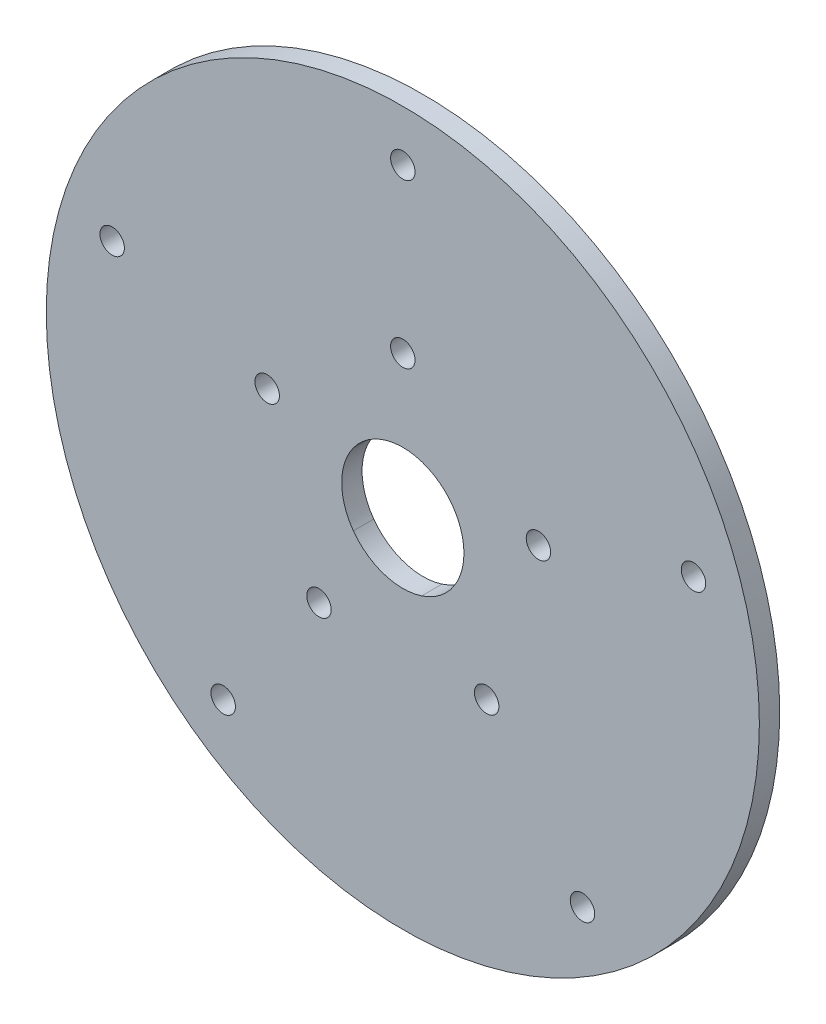
ISO-10303-21;
HEADER;
FILE_DESCRIPTION(('STEP AP214'),'2;1');
FILE_NAME('part.step','',(''),(''),'','','');
FILE_SCHEMA(('AUTOMOTIVE_DESIGN { 1 0 10303 214 1 1 1 1 }'));
ENDSEC;
DATA;
#1=APPLICATION_CONTEXT('core data for automotive mechanical design processes');
#2=APPLICATION_PROTOCOL_DEFINITION('international standard','automotive_design',2000,#1);
#3=PRODUCT_CONTEXT('',#1,'mechanical');
#4=PRODUCT('Part','Part','',(#3));
#5=PRODUCT_RELATED_PRODUCT_CATEGORY('part','',(#4));
#6=PRODUCT_DEFINITION_FORMATION('','',#4);
#7=PRODUCT_DEFINITION_CONTEXT('part definition',#1,'design');
#8=PRODUCT_DEFINITION('design','',#6,#7);
#9=PRODUCT_DEFINITION_SHAPE('','',#8);
#10=(LENGTH_UNIT() NAMED_UNIT(*) SI_UNIT(.MILLI.,.METRE.));
#11=(NAMED_UNIT(*) PLANE_ANGLE_UNIT() SI_UNIT($,.RADIAN.));
#12=(NAMED_UNIT(*) SI_UNIT($,.STERADIAN.) SOLID_ANGLE_UNIT());
#13=UNCERTAINTY_MEASURE_WITH_UNIT(LENGTH_MEASURE(1.E-05),#10,'distance_accuracy_value','');
#14=(GEOMETRIC_REPRESENTATION_CONTEXT(3) GLOBAL_UNCERTAINTY_ASSIGNED_CONTEXT((#13)) GLOBAL_UNIT_ASSIGNED_CONTEXT((#10,
#11,#12)) REPRESENTATION_CONTEXT('',''));
#15=CARTESIAN_POINT('',(0.,0.,0.));
#16=DIRECTION('',(0.,0.,1.));
#17=DIRECTION('',(1.,0.,0.));
#18=AXIS2_PLACEMENT_3D('',#15,#16,#17);
#19=CARTESIAN_POINT('',(0.00111803398874989,0.000363271264002675,10.));
#20=DIRECTION('',(0.,0.,-1.));
#21=DIRECTION('',(-1.,0.,0.));
#22=AXIS2_PLACEMENT_3D('',#19,#20,#21);
#23=CYLINDRICAL_SURFACE('',#22,30.);
#24=CARTESIAN_POINT('',(0.00111803398874989,0.000363271264002675,0.));
#25=DIRECTION('',(0.,0.,1.));
#26=DIRECTION('',(1.,0.,0.));
#27=AXIS2_PLACEMENT_3D('',#24,#25,#26);
#28=CIRCLE('',#27,30.);
#29=CARTESIAN_POINT('',(9.27106884637913,-28.5315138477736,0.));
#30=VERTEX_POINT('',#29);
#31=CARTESIAN_POINT('',(30.0011180282306,0.000951056604623031,0.));
#32=VERTEX_POINT('',#31);
#33=EDGE_CURVE('E113',#30,#32,#28,.T.);
#34=ORIENTED_EDGE('',*,*,#33,.F.);
#35=DIRECTION('',(0.,0.,-1.));
#36=VECTOR('',#35,1.);
#37=CARTESIAN_POINT('',(9.27106884637913,-28.5315138477736,10.));
#38=LINE('',#37,#36);
#39=CARTESIAN_POINT('',(9.27106884637913,-28.5315138477736,10.));
#40=VERTEX_POINT('',#39);
#41=EDGE_CURVE('E11',#40,#30,#38,.T.);
#42=ORIENTED_EDGE('',*,*,#41,.F.);
#43=CARTESIAN_POINT('',(0.00111803398874989,0.000363271264002675,10.));
#44=DIRECTION('',(0.,0.,1.));
#45=DIRECTION('',(1.,0.,0.));
#46=AXIS2_PLACEMENT_3D('',#43,#44,#45);
#47=CIRCLE('',#46,30.);
#48=CARTESIAN_POINT('',(30.0011180282306,0.000951056604623031,10.));
#49=VERTEX_POINT('',#48);
#50=EDGE_CURVE('E128',#40,#49,#47,.T.);
#51=ORIENTED_EDGE('',*,*,#50,.T.);
#52=DIRECTION('',(0.,0.,-1.));
#53=VECTOR('',#52,1.);
#54=CARTESIAN_POINT('',(30.0011180282306,0.000951056604623031,10.));
#55=LINE('',#54,#53);
#56=EDGE_CURVE('E52',#49,#32,#55,.T.);
#57=ORIENTED_EDGE('',*,*,#56,.T.);
#58=EDGE_LOOP('',(#34,#42,#51,#57));
#59=FACE_BOUND('',#58,.T.);
#60=ADVANCED_FACE('F36',(#59),#23,.F.);
#61=CARTESIAN_POINT('',(0.,0.,10.));
#62=DIRECTION('',(0.,0.,-1.));
#63=DIRECTION('',(-1.,0.,0.));
#64=AXIS2_PLACEMENT_3D('',#61,#62,#63);
#65=CYLINDRICAL_SURFACE('',#64,30.);
#66=CARTESIAN_POINT('',(0.,0.,0.));
#67=DIRECTION('',(0.,0.,1.));
#68=DIRECTION('',(1.,0.,0.));
#69=AXIS2_PLACEMENT_3D('',#66,#67,#68);
#70=CIRCLE('',#69,30.);
#71=CARTESIAN_POINT('',(-24.2708553180407,-17.6330820372031,0.));
#72=VERTEX_POINT('',#71);
#73=EDGE_CURVE('E115',#72,#30,#70,.T.);
#74=ORIENTED_EDGE('',*,*,#73,.F.);
#75=DIRECTION('',(0.,0.,-1.));
#76=VECTOR('',#75,1.);
#77=CARTESIAN_POINT('',(-24.2708553180407,-17.6330820372031,10.));
#78=LINE('',#77,#76);
#79=CARTESIAN_POINT('',(-24.2708553180407,-17.6330820372031,10.));
#80=VERTEX_POINT('',#79);
#81=EDGE_CURVE('E44',#80,#72,#78,.T.);
#82=ORIENTED_EDGE('',*,*,#81,.F.);
#83=CARTESIAN_POINT('',(0.,0.,10.));
#84=DIRECTION('',(0.,0.,1.));
#85=DIRECTION('',(1.,0.,0.));
#86=AXIS2_PLACEMENT_3D('',#83,#84,#85);
#87=CIRCLE('',#86,30.);
#88=EDGE_CURVE('E102',#80,#40,#87,.T.);
#89=ORIENTED_EDGE('',*,*,#88,.T.);
#90=ORIENTED_EDGE('',*,*,#41,.T.);
#91=EDGE_LOOP('',(#74,#82,#89,#90));
#92=FACE_BOUND('',#91,.T.);
#93=ADVANCED_FACE('F132',(#92),#65,.F.);
#94=CARTESIAN_POINT('',(-0.000690983005625056,0.000951056516295156,10.));
#95=DIRECTION('',(0.,0.,-1.));
#96=DIRECTION('',(-1.,0.,0.));
#97=AXIS2_PLACEMENT_3D('',#94,#95,#96);
#98=CYLINDRICAL_SURFACE('',#97,30.);
#99=CARTESIAN_POINT('',(-0.000690983005625056,0.000951056516295156,0.));
#100=DIRECTION('',(0.,0.,1.));
#101=DIRECTION('',(1.,0.,0.));
#102=AXIS2_PLACEMENT_3D('',#99,#100,#101);
#103=CIRCLE('',#102,30.);
#104=CARTESIAN_POINT('',(-24.2708553180927,17.6349841501641,0.));
#105=VERTEX_POINT('',#104);
#106=EDGE_CURVE('E89',#105,#72,#103,.T.);
#107=ORIENTED_EDGE('',*,*,#106,.F.);
#108=DIRECTION('',(0.,0.,-1.));
#109=VECTOR('',#108,1.);
#110=CARTESIAN_POINT('',(-24.2708553180927,17.6349841501641,10.));
#111=LINE('',#110,#109);
#112=CARTESIAN_POINT('',(-24.2708553180927,17.6349841501641,10.));
#113=VERTEX_POINT('',#112);
#114=EDGE_CURVE('E84',#113,#105,#111,.T.);
#115=ORIENTED_EDGE('',*,*,#114,.F.);
#116=CARTESIAN_POINT('',(-0.000690983005625056,0.000951056516295156,10.));
#117=DIRECTION('',(0.,0.,1.));
#118=DIRECTION('',(1.,0.,0.));
#119=AXIS2_PLACEMENT_3D('',#116,#117,#118);
#120=CIRCLE('',#119,30.);
#121=EDGE_CURVE('E87',#113,#80,#120,.T.);
#122=ORIENTED_EDGE('',*,*,#121,.T.);
#123=ORIENTED_EDGE('',*,*,#81,.T.);
#124=EDGE_LOOP('',(#107,#115,#122,#123));
#125=FACE_BOUND('',#124,.T.);
#126=ADVANCED_FACE('F86',(#125),#98,.F.);
#127=CARTESIAN_POINT('',(0.,0.00190211303259031,10.));
#128=DIRECTION('',(0.,0.,-1.));
#129=DIRECTION('',(-1.,0.,0.));
#130=AXIS2_PLACEMENT_3D('',#127,#128,#129);
#131=CYLINDRICAL_SURFACE('',#130,30.);
#132=CARTESIAN_POINT('',(0.,0.00190211303259031,0.));
#133=DIRECTION('',(0.,0.,1.));
#134=DIRECTION('',(1.,0.,0.));
#135=AXIS2_PLACEMENT_3D('',#132,#133,#134);
#136=CIRCLE('',#135,30.);
#137=CARTESIAN_POINT('',(9.27106884654775,28.5334159607514,0.));
#138=VERTEX_POINT('',#137);
#139=EDGE_CURVE('E120',#138,#105,#136,.T.);
#140=ORIENTED_EDGE('',*,*,#139,.F.);
#141=DIRECTION('',(0.,0.,-1.));
#142=VECTOR('',#141,1.);
#143=CARTESIAN_POINT('',(9.27106884654775,28.5334159607514,10.));
#144=LINE('',#143,#142);
#145=CARTESIAN_POINT('',(9.27106884654775,28.5334159607514,10.));
#146=VERTEX_POINT('',#145);
#147=EDGE_CURVE('E68',#146,#138,#144,.T.);
#148=ORIENTED_EDGE('',*,*,#147,.F.);
#149=CARTESIAN_POINT('',(0.,0.00190211303259031,10.));
#150=DIRECTION('',(0.,0.,1.));
#151=DIRECTION('',(1.,0.,0.));
#152=AXIS2_PLACEMENT_3D('',#149,#150,#151);
#153=CIRCLE('',#152,30.);
#154=EDGE_CURVE('E100',#146,#113,#153,.T.);
#155=ORIENTED_EDGE('',*,*,#154,.T.);
#156=ORIENTED_EDGE('',*,*,#114,.T.);
#157=EDGE_LOOP('',(#140,#148,#155,#156));
#158=FACE_BOUND('',#157,.T.);
#159=ADVANCED_FACE('F104',(#158),#131,.F.);
#160=CARTESIAN_POINT('',(0.0011180339887499,0.00153884176858762,10.));
#161=DIRECTION('',(0.,0.,-1.));
#162=DIRECTION('',(-1.,0.,0.));
#163=AXIS2_PLACEMENT_3D('',#160,#161,#162);
#164=CYLINDRICAL_SURFACE('',#163,30.);
#165=CARTESIAN_POINT('',(0.0011180339887499,0.00153884176858762,0.));
#166=DIRECTION('',(0.,0.,1.));
#167=DIRECTION('',(1.,0.,0.));
#168=AXIS2_PLACEMENT_3D('',#165,#166,#167);
#169=CIRCLE('',#168,30.);
#170=EDGE_CURVE('E122',#32,#138,#169,.T.);
#171=ORIENTED_EDGE('',*,*,#170,.F.);
#172=ORIENTED_EDGE('',*,*,#56,.F.);
#173=CARTESIAN_POINT('',(0.0011180339887499,0.00153884176858762,10.));
#174=DIRECTION('',(0.,0.,1.));
#175=DIRECTION('',(1.,0.,0.));
#176=AXIS2_PLACEMENT_3D('',#173,#174,#175);
#177=CIRCLE('',#176,30.);
#178=EDGE_CURVE('E105',#49,#146,#177,.T.);
#179=ORIENTED_EDGE('',*,*,#178,.T.);
#180=ORIENTED_EDGE('',*,*,#147,.T.);
#181=EDGE_LOOP('',(#171,#172,#179,#180));
#182=FACE_BOUND('',#181,.T.);
#183=ADVANCED_FACE('F136',(#182),#164,.F.);
#184=CARTESIAN_POINT('',(0.,0.,10.));
#185=DIRECTION('',(0.,0.,-1.));
#186=DIRECTION('',(-1.,0.,0.));
#187=AXIS2_PLACEMENT_3D('',#184,#185,#186);
#188=CYLINDRICAL_SURFACE('',#187,175.);
#189=CARTESIAN_POINT('',(0.,0.,10.));
#190=DIRECTION('',(0.,0.,1.));
#191=DIRECTION('',(1.,0.,0.));
#192=AXIS2_PLACEMENT_3D('',#189,#190,#191);
#193=CIRCLE('',#192,175.);
#194=CARTESIAN_POINT('',(175.,0.,10.));
#195=VERTEX_POINT('',#194);
#196=EDGE_CURVE('E107',#195,#195,#193,.T.);
#197=ORIENTED_EDGE('',*,*,#196,.F.);
#198=EDGE_LOOP('',(#197));
#199=FACE_BOUND('',#198,.T.);
#200=CARTESIAN_POINT('',(0.,0.,0.));
#201=DIRECTION('',(0.,0.,1.));
#202=DIRECTION('',(1.,0.,0.));
#203=AXIS2_PLACEMENT_3D('',#200,#201,#202);
#204=CIRCLE('',#203,175.);
#205=CARTESIAN_POINT('',(175.,0.,0.));
#206=VERTEX_POINT('',#205);
#207=EDGE_CURVE('E125',#206,#206,#204,.T.);
#208=ORIENTED_EDGE('',*,*,#207,.T.);
#209=EDGE_LOOP('',(#208));
#210=FACE_BOUND('',#209,.T.);
#211=ADVANCED_FACE('F138',(#199,#210),#188,.T.);
#212=CARTESIAN_POINT('',(0.,0.,10.));
#213=DIRECTION('',(0.,0.,1.));
#214=DIRECTION('',(1.,0.,0.));
#215=AXIS2_PLACEMENT_3D('',#212,#213,#214);
#216=PLANE('',#215);
#217=CARTESIAN_POINT('',(-142.658477444273,46.3525491562417,10.));
#218=DIRECTION('',(0.,0.,-1.));
#219=DIRECTION('',(-0.309016994374945,-0.951056516295155,0.));
#220=AXIS2_PLACEMENT_3D('',#217,#218,#219);
#221=CIRCLE('',#220,6.00000000000001);
#222=CARTESIAN_POINT('',(-144.512579410523,40.6462100584708,10.));
#223=VERTEX_POINT('',#222);
#224=EDGE_CURVE('E296',#223,#223,#221,.T.);
#225=ORIENTED_EDGE('',*,*,#224,.T.);
#226=EDGE_LOOP('',(#225));
#227=FACE_BOUND('',#226,.T.);
#228=CARTESIAN_POINT('',(-41.1449676604728,-56.6311896062466,10.));
#229=DIRECTION('',(0.,0.,-1.));
#230=DIRECTION('',(0.809016994374951,-0.587785252292469,0.));
#231=AXIS2_PLACEMENT_3D('',#228,#229,#230);
#232=CIRCLE('',#231,6.00000000000001);
#233=CARTESIAN_POINT('',(-36.2908656942231,-60.1579011200014,10.));
#234=VERTEX_POINT('',#233);
#235=EDGE_CURVE('E300',#234,#234,#232,.T.);
#236=ORIENTED_EDGE('',*,*,#235,.T.);
#237=EDGE_LOOP('',(#236));
#238=FACE_BOUND('',#237,.T.);
#239=CARTESIAN_POINT('',(-88.1677878438703,-121.352549156243,10.));
#240=DIRECTION('',(0.,0.,-1.));
#241=DIRECTION('',(0.809016994374951,-0.587785252292469,0.));
#242=AXIS2_PLACEMENT_3D('',#239,#240,#241);
#243=CIRCLE('',#242,6.00000000000001);
#244=CARTESIAN_POINT('',(-83.3136858776206,-124.879260669997,10.));
#245=VERTEX_POINT('',#244);
#246=EDGE_CURVE('E310',#245,#245,#243,.T.);
#247=ORIENTED_EDGE('',*,*,#246,.T.);
#248=EDGE_LOOP('',(#247));
#249=FACE_BOUND('',#248,.T.);
#250=CARTESIAN_POINT('',(41.1449676604736,-56.631189606246,10.));
#251=DIRECTION('',(0.,0.,-1.));
#252=DIRECTION('',(0.809016994374942,0.58778525229248,0.));
#253=AXIS2_PLACEMENT_3D('',#250,#251,#252);
#254=CIRCLE('',#253,6.00000000000001);
#255=CARTESIAN_POINT('',(45.9990696267233,-53.1044780924911,10.));
#256=VERTEX_POINT('',#255);
#257=EDGE_CURVE('E316',#256,#256,#254,.T.);
#258=ORIENTED_EDGE('',*,*,#257,.T.);
#259=EDGE_LOOP('',(#258));
#260=FACE_BOUND('',#259,.T.);
#261=CARTESIAN_POINT('',(88.167787843872,-121.352549156241,10.));
#262=DIRECTION('',(0.,0.,-1.));
#263=DIRECTION('',(0.809016994374942,0.58778525229248,0.));
#264=AXIS2_PLACEMENT_3D('',#261,#262,#263);
#265=CIRCLE('',#264,6.00000000000001);
#266=CARTESIAN_POINT('',(93.0218898101217,-117.825837642486,10.));
#267=VERTEX_POINT('',#266);
#268=EDGE_CURVE('E322',#267,#267,#265,.T.);
#269=ORIENTED_EDGE('',*,*,#268,.T.);
#270=EDGE_LOOP('',(#269));
#271=FACE_BOUND('',#270,.T.);
#272=CARTESIAN_POINT('',(66.5739561406605,21.6311896062471,10.));
#273=DIRECTION('',(0.,0.,-1.));
#274=DIRECTION('',(-0.309016994374958,0.95105651629515,0.));
#275=AXIS2_PLACEMENT_3D('',#272,#273,#274);
#276=CIRCLE('',#275,6.00000000000001);
#277=CARTESIAN_POINT('',(64.7198541744108,27.337528704018,10.));
#278=VERTEX_POINT('',#277);
#279=EDGE_CURVE('E328',#278,#278,#276,.T.);
#280=ORIENTED_EDGE('',*,*,#279,.T.);
#281=EDGE_LOOP('',(#280));
#282=FACE_BOUND('',#281,.T.);
#283=CARTESIAN_POINT('',(142.658477444273,46.3525491562437,10.));
#284=DIRECTION('',(0.,0.,-1.));
#285=DIRECTION('',(-0.309016994374958,0.95105651629515,0.));
#286=AXIS2_PLACEMENT_3D('',#283,#284,#285);
#287=CIRCLE('',#286,6.00000000000001);
#288=CARTESIAN_POINT('',(140.804375478023,52.0588882540146,10.));
#289=VERTEX_POINT('',#288);
#290=EDGE_CURVE('E334',#289,#289,#287,.T.);
#291=ORIENTED_EDGE('',*,*,#290,.T.);
#292=EDGE_LOOP('',(#291));
#293=FACE_BOUND('',#292,.T.);
#294=CARTESIAN_POINT('',(-66.5739561406608,21.6311896062461,10.));
#295=DIRECTION('',(0.,0.,-1.));
#296=DIRECTION('',(-0.309016994374945,-0.951056516295155,0.));
#297=AXIS2_PLACEMENT_3D('',#294,#295,#296);
#298=CIRCLE('',#297,6.00000000000001);
#299=CARTESIAN_POINT('',(-68.4280581069105,15.9248505084752,10.));
#300=VERTEX_POINT('',#299);
#301=EDGE_CURVE('E340',#300,#300,#298,.T.);
#302=ORIENTED_EDGE('',*,*,#301,.T.);
#303=EDGE_LOOP('',(#302));
#304=FACE_BOUND('',#303,.T.);
#305=CARTESIAN_POINT('',(0.,150.,10.));
#306=DIRECTION('',(0.,0.,-1.));
#307=DIRECTION('',(-1.,0.,0.));
#308=AXIS2_PLACEMENT_3D('',#305,#306,#307);
#309=CIRCLE('',#308,6.00000000000001);
#310=CARTESIAN_POINT('',(-6.00000000000001,150.,10.));
#311=VERTEX_POINT('',#310);
#312=EDGE_CURVE('E346',#311,#311,#309,.T.);
#313=ORIENTED_EDGE('',*,*,#312,.T.);
#314=EDGE_LOOP('',(#313));
#315=FACE_BOUND('',#314,.T.);
#316=CARTESIAN_POINT('',(0.,70.,10.));
#317=DIRECTION('',(0.,0.,-1.));
#318=DIRECTION('',(-1.,0.,0.));
#319=AXIS2_PLACEMENT_3D('',#316,#317,#318);
#320=CIRCLE('',#319,6.00000000000001);
#321=CARTESIAN_POINT('',(-6.00000000000001,70.,10.));
#322=VERTEX_POINT('',#321);
#323=EDGE_CURVE('E116',#322,#322,#320,.T.);
#324=ORIENTED_EDGE('',*,*,#323,.T.);
#325=EDGE_LOOP('',(#324));
#326=FACE_BOUND('',#325,.T.);
#327=ORIENTED_EDGE('',*,*,#50,.F.);
#328=ORIENTED_EDGE('',*,*,#88,.F.);
#329=ORIENTED_EDGE('',*,*,#121,.F.);
#330=ORIENTED_EDGE('',*,*,#154,.F.);
#331=ORIENTED_EDGE('',*,*,#178,.F.);
#332=EDGE_LOOP('',(#327,#328,#329,#330,#331));
#333=FACE_BOUND('',#332,.T.);
#334=ORIENTED_EDGE('',*,*,#196,.T.);
#335=EDGE_LOOP('',(#334));
#336=FACE_BOUND('',#335,.T.);
#337=ADVANCED_FACE('F97',(#227,#238,#249,#260,#271,#282,#293,#304,#315,#326,#333,#336),#216,.T.);
#338=CARTESIAN_POINT('',(0.,0.,0.));
#339=DIRECTION('',(0.,0.,1.));
#340=DIRECTION('',(1.,0.,0.));
#341=AXIS2_PLACEMENT_3D('',#338,#339,#340);
#342=PLANE('',#341);
#343=CARTESIAN_POINT('',(-142.658477444273,46.3525491562417,0.));
#344=DIRECTION('',(0.,0.,-1.));
#345=DIRECTION('',(-0.309016994374945,-0.951056516295155,0.));
#346=AXIS2_PLACEMENT_3D('',#343,#344,#345);
#347=CIRCLE('',#346,6.00000000000001);
#348=CARTESIAN_POINT('',(-144.512579410523,40.6462100584708,0.));
#349=VERTEX_POINT('',#348);
#350=EDGE_CURVE('E299',#349,#349,#347,.T.);
#351=ORIENTED_EDGE('',*,*,#350,.F.);
#352=EDGE_LOOP('',(#351));
#353=FACE_BOUND('',#352,.T.);
#354=CARTESIAN_POINT('',(-41.1449676604728,-56.6311896062466,0.));
#355=DIRECTION('',(0.,0.,-1.));
#356=DIRECTION('',(0.809016994374951,-0.587785252292469,0.));
#357=AXIS2_PLACEMENT_3D('',#354,#355,#356);
#358=CIRCLE('',#357,6.00000000000001);
#359=CARTESIAN_POINT('',(-36.2908656942231,-60.1579011200014,0.));
#360=VERTEX_POINT('',#359);
#361=EDGE_CURVE('E305',#360,#360,#358,.T.);
#362=ORIENTED_EDGE('',*,*,#361,.F.);
#363=EDGE_LOOP('',(#362));
#364=FACE_BOUND('',#363,.T.);
#365=CARTESIAN_POINT('',(-88.1677878438703,-121.352549156243,0.));
#366=DIRECTION('',(0.,0.,-1.));
#367=DIRECTION('',(0.809016994374951,-0.587785252292469,0.));
#368=AXIS2_PLACEMENT_3D('',#365,#366,#367);
#369=CIRCLE('',#368,6.00000000000001);
#370=CARTESIAN_POINT('',(-83.3136858776206,-124.879260669997,0.));
#371=VERTEX_POINT('',#370);
#372=EDGE_CURVE('E313',#371,#371,#369,.T.);
#373=ORIENTED_EDGE('',*,*,#372,.F.);
#374=EDGE_LOOP('',(#373));
#375=FACE_BOUND('',#374,.T.);
#376=CARTESIAN_POINT('',(41.1449676604736,-56.631189606246,0.));
#377=DIRECTION('',(0.,0.,-1.));
#378=DIRECTION('',(0.809016994374942,0.58778525229248,0.));
#379=AXIS2_PLACEMENT_3D('',#376,#377,#378);
#380=CIRCLE('',#379,6.00000000000001);
#381=CARTESIAN_POINT('',(45.9990696267233,-53.1044780924911,0.));
#382=VERTEX_POINT('',#381);
#383=EDGE_CURVE('E319',#382,#382,#380,.T.);
#384=ORIENTED_EDGE('',*,*,#383,.F.);
#385=EDGE_LOOP('',(#384));
#386=FACE_BOUND('',#385,.T.);
#387=CARTESIAN_POINT('',(88.167787843872,-121.352549156241,0.));
#388=DIRECTION('',(0.,0.,-1.));
#389=DIRECTION('',(0.809016994374942,0.58778525229248,0.));
#390=AXIS2_PLACEMENT_3D('',#387,#388,#389);
#391=CIRCLE('',#390,6.00000000000001);
#392=CARTESIAN_POINT('',(93.0218898101217,-117.825837642486,0.));
#393=VERTEX_POINT('',#392);
#394=EDGE_CURVE('E325',#393,#393,#391,.T.);
#395=ORIENTED_EDGE('',*,*,#394,.F.);
#396=EDGE_LOOP('',(#395));
#397=FACE_BOUND('',#396,.T.);
#398=CARTESIAN_POINT('',(66.5739561406605,21.6311896062471,0.));
#399=DIRECTION('',(0.,0.,-1.));
#400=DIRECTION('',(-0.309016994374958,0.95105651629515,0.));
#401=AXIS2_PLACEMENT_3D('',#398,#399,#400);
#402=CIRCLE('',#401,6.00000000000001);
#403=CARTESIAN_POINT('',(64.7198541744108,27.337528704018,0.));
#404=VERTEX_POINT('',#403);
#405=EDGE_CURVE('E331',#404,#404,#402,.T.);
#406=ORIENTED_EDGE('',*,*,#405,.F.);
#407=EDGE_LOOP('',(#406));
#408=FACE_BOUND('',#407,.T.);
#409=CARTESIAN_POINT('',(142.658477444273,46.3525491562437,0.));
#410=DIRECTION('',(0.,0.,-1.));
#411=DIRECTION('',(-0.309016994374958,0.95105651629515,0.));
#412=AXIS2_PLACEMENT_3D('',#409,#410,#411);
#413=CIRCLE('',#412,6.00000000000001);
#414=CARTESIAN_POINT('',(140.804375478023,52.0588882540146,0.));
#415=VERTEX_POINT('',#414);
#416=EDGE_CURVE('E337',#415,#415,#413,.T.);
#417=ORIENTED_EDGE('',*,*,#416,.F.);
#418=EDGE_LOOP('',(#417));
#419=FACE_BOUND('',#418,.T.);
#420=CARTESIAN_POINT('',(-66.5739561406608,21.6311896062461,0.));
#421=DIRECTION('',(0.,0.,-1.));
#422=DIRECTION('',(-0.309016994374945,-0.951056516295155,0.));
#423=AXIS2_PLACEMENT_3D('',#420,#421,#422);
#424=CIRCLE('',#423,6.00000000000001);
#425=CARTESIAN_POINT('',(-68.4280581069105,15.9248505084752,0.));
#426=VERTEX_POINT('',#425);
#427=EDGE_CURVE('E302',#426,#426,#424,.T.);
#428=ORIENTED_EDGE('',*,*,#427,.F.);
#429=EDGE_LOOP('',(#428));
#430=FACE_BOUND('',#429,.T.);
#431=CARTESIAN_POINT('',(0.,150.,0.));
#432=DIRECTION('',(0.,0.,-1.));
#433=DIRECTION('',(-1.,0.,0.));
#434=AXIS2_PLACEMENT_3D('',#431,#432,#433);
#435=CIRCLE('',#434,6.00000000000001);
#436=CARTESIAN_POINT('',(-6.00000000000001,150.,0.));
#437=VERTEX_POINT('',#436);
#438=EDGE_CURVE('E343',#437,#437,#435,.T.);
#439=ORIENTED_EDGE('',*,*,#438,.F.);
#440=EDGE_LOOP('',(#439));
#441=FACE_BOUND('',#440,.T.);
#442=CARTESIAN_POINT('',(0.,70.,0.));
#443=DIRECTION('',(0.,0.,-1.));
#444=DIRECTION('',(-1.,0.,0.));
#445=AXIS2_PLACEMENT_3D('',#442,#443,#444);
#446=CIRCLE('',#445,6.00000000000001);
#447=CARTESIAN_POINT('',(-6.00000000000001,70.,0.));
#448=VERTEX_POINT('',#447);
#449=EDGE_CURVE('E349',#448,#448,#446,.T.);
#450=ORIENTED_EDGE('',*,*,#449,.F.);
#451=EDGE_LOOP('',(#450));
#452=FACE_BOUND('',#451,.T.);
#453=ORIENTED_EDGE('',*,*,#33,.T.);
#454=ORIENTED_EDGE('',*,*,#170,.T.);
#455=ORIENTED_EDGE('',*,*,#139,.T.);
#456=ORIENTED_EDGE('',*,*,#106,.T.);
#457=ORIENTED_EDGE('',*,*,#73,.T.);
#458=EDGE_LOOP('',(#453,#454,#455,#456,#457));
#459=FACE_BOUND('',#458,.T.);
#460=ORIENTED_EDGE('',*,*,#207,.F.);
#461=EDGE_LOOP('',(#460));
#462=FACE_BOUND('',#461,.T.);
#463=ADVANCED_FACE('F134',(#353,#364,#375,#386,#397,#408,#419,#430,#441,#452,#459,#462),#342,.F.);
#464=CARTESIAN_POINT('',(0.,70.,10.));
#465=DIRECTION('',(0.,0.,-1.));
#466=DIRECTION('',(-1.,0.,0.));
#467=AXIS2_PLACEMENT_3D('',#464,#465,#466);
#468=CYLINDRICAL_SURFACE('',#467,6.00000000000001);
#469=ORIENTED_EDGE('',*,*,#323,.F.);
#470=EDGE_LOOP('',(#469));
#471=FACE_BOUND('',#470,.T.);
#472=ORIENTED_EDGE('',*,*,#449,.T.);
#473=EDGE_LOOP('',(#472));
#474=FACE_BOUND('',#473,.T.);
#475=ADVANCED_FACE('F178',(#471,#474),#468,.F.);
#476=CARTESIAN_POINT('',(0.,150.,10.));
#477=DIRECTION('',(0.,0.,-1.));
#478=DIRECTION('',(-1.,0.,0.));
#479=AXIS2_PLACEMENT_3D('',#476,#477,#478);
#480=CYLINDRICAL_SURFACE('',#479,6.00000000000001);
#481=ORIENTED_EDGE('',*,*,#312,.F.);
#482=EDGE_LOOP('',(#481));
#483=FACE_BOUND('',#482,.T.);
#484=ORIENTED_EDGE('',*,*,#438,.T.);
#485=EDGE_LOOP('',(#484));
#486=FACE_BOUND('',#485,.T.);
#487=ADVANCED_FACE('F183',(#483,#486),#480,.F.);
#488=CARTESIAN_POINT('',(-66.5739561406608,21.6311896062461,10.));
#489=DIRECTION('',(0.,0.,-1.));
#490=DIRECTION('',(-1.,0.,0.));
#491=AXIS2_PLACEMENT_3D('',#488,#489,#490);
#492=CYLINDRICAL_SURFACE('',#491,6.00000000000001);
#493=ORIENTED_EDGE('',*,*,#301,.F.);
#494=EDGE_LOOP('',(#493));
#495=FACE_BOUND('',#494,.T.);
#496=ORIENTED_EDGE('',*,*,#427,.T.);
#497=EDGE_LOOP('',(#496));
#498=FACE_BOUND('',#497,.T.);
#499=ADVANCED_FACE('F195',(#495,#498),#492,.F.);
#500=CARTESIAN_POINT('',(142.658477444273,46.3525491562437,10.));
#501=DIRECTION('',(0.,0.,-1.));
#502=DIRECTION('',(-1.,0.,0.));
#503=AXIS2_PLACEMENT_3D('',#500,#501,#502);
#504=CYLINDRICAL_SURFACE('',#503,6.00000000000001);
#505=ORIENTED_EDGE('',*,*,#290,.F.);
#506=EDGE_LOOP('',(#505));
#507=FACE_BOUND('',#506,.T.);
#508=ORIENTED_EDGE('',*,*,#416,.T.);
#509=EDGE_LOOP('',(#508));
#510=FACE_BOUND('',#509,.T.);
#511=ADVANCED_FACE('F219',(#507,#510),#504,.F.);
#512=CARTESIAN_POINT('',(66.5739561406605,21.6311896062471,10.));
#513=DIRECTION('',(0.,0.,-1.));
#514=DIRECTION('',(-1.,0.,0.));
#515=AXIS2_PLACEMENT_3D('',#512,#513,#514);
#516=CYLINDRICAL_SURFACE('',#515,6.00000000000001);
#517=ORIENTED_EDGE('',*,*,#279,.F.);
#518=EDGE_LOOP('',(#517));
#519=FACE_BOUND('',#518,.T.);
#520=ORIENTED_EDGE('',*,*,#405,.T.);
#521=EDGE_LOOP('',(#520));
#522=FACE_BOUND('',#521,.T.);
#523=ADVANCED_FACE('F229',(#519,#522),#516,.F.);
#524=CARTESIAN_POINT('',(88.167787843872,-121.352549156241,10.));
#525=DIRECTION('',(0.,0.,-1.));
#526=DIRECTION('',(-1.,0.,0.));
#527=AXIS2_PLACEMENT_3D('',#524,#525,#526);
#528=CYLINDRICAL_SURFACE('',#527,6.00000000000001);
#529=ORIENTED_EDGE('',*,*,#268,.F.);
#530=EDGE_LOOP('',(#529));
#531=FACE_BOUND('',#530,.T.);
#532=ORIENTED_EDGE('',*,*,#394,.T.);
#533=EDGE_LOOP('',(#532));
#534=FACE_BOUND('',#533,.T.);
#535=ADVANCED_FACE('F239',(#531,#534),#528,.F.);
#536=CARTESIAN_POINT('',(41.1449676604736,-56.631189606246,10.));
#537=DIRECTION('',(0.,0.,-1.));
#538=DIRECTION('',(-1.,0.,0.));
#539=AXIS2_PLACEMENT_3D('',#536,#537,#538);
#540=CYLINDRICAL_SURFACE('',#539,6.00000000000001);
#541=ORIENTED_EDGE('',*,*,#257,.F.);
#542=EDGE_LOOP('',(#541));
#543=FACE_BOUND('',#542,.T.);
#544=ORIENTED_EDGE('',*,*,#383,.T.);
#545=EDGE_LOOP('',(#544));
#546=FACE_BOUND('',#545,.T.);
#547=ADVANCED_FACE('F249',(#543,#546),#540,.F.);
#548=CARTESIAN_POINT('',(-88.1677878438703,-121.352549156243,10.));
#549=DIRECTION('',(0.,0.,-1.));
#550=DIRECTION('',(-1.,0.,0.));
#551=AXIS2_PLACEMENT_3D('',#548,#549,#550);
#552=CYLINDRICAL_SURFACE('',#551,6.00000000000001);
#553=ORIENTED_EDGE('',*,*,#246,.F.);
#554=EDGE_LOOP('',(#553));
#555=FACE_BOUND('',#554,.T.);
#556=ORIENTED_EDGE('',*,*,#372,.T.);
#557=EDGE_LOOP('',(#556));
#558=FACE_BOUND('',#557,.T.);
#559=ADVANCED_FACE('F259',(#555,#558),#552,.F.);
#560=CARTESIAN_POINT('',(-41.1449676604728,-56.6311896062466,10.));
#561=DIRECTION('',(0.,0.,-1.));
#562=DIRECTION('',(-1.,0.,0.));
#563=AXIS2_PLACEMENT_3D('',#560,#561,#562);
#564=CYLINDRICAL_SURFACE('',#563,6.00000000000001);
#565=ORIENTED_EDGE('',*,*,#235,.F.);
#566=EDGE_LOOP('',(#565));
#567=FACE_BOUND('',#566,.T.);
#568=ORIENTED_EDGE('',*,*,#361,.T.);
#569=EDGE_LOOP('',(#568));
#570=FACE_BOUND('',#569,.T.);
#571=ADVANCED_FACE('F269',(#567,#570),#564,.F.);
#572=CARTESIAN_POINT('',(-142.658477444273,46.3525491562417,10.));
#573=DIRECTION('',(0.,0.,-1.));
#574=DIRECTION('',(-1.,0.,0.));
#575=AXIS2_PLACEMENT_3D('',#572,#573,#574);
#576=CYLINDRICAL_SURFACE('',#575,6.00000000000001);
#577=ORIENTED_EDGE('',*,*,#224,.F.);
#578=EDGE_LOOP('',(#577));
#579=FACE_BOUND('',#578,.T.);
#580=ORIENTED_EDGE('',*,*,#350,.T.);
#581=EDGE_LOOP('',(#580));
#582=FACE_BOUND('',#581,.T.);
#583=ADVANCED_FACE('F279',(#579,#582),#576,.F.);
#584=CLOSED_SHELL('',(#60,#93,#126,#159,#183,#211,#337,#463,#475,#487,#499,#511,#523,#535,#547,
#559,#571,#583));
#585=MANIFOLD_SOLID_BREP('B2',#584);
#586=ADVANCED_BREP_SHAPE_REPRESENTATION('',(#18,#585),#14);
#587=SHAPE_DEFINITION_REPRESENTATION(#9,#586);
ENDSEC;
END-ISO-10303-21;
